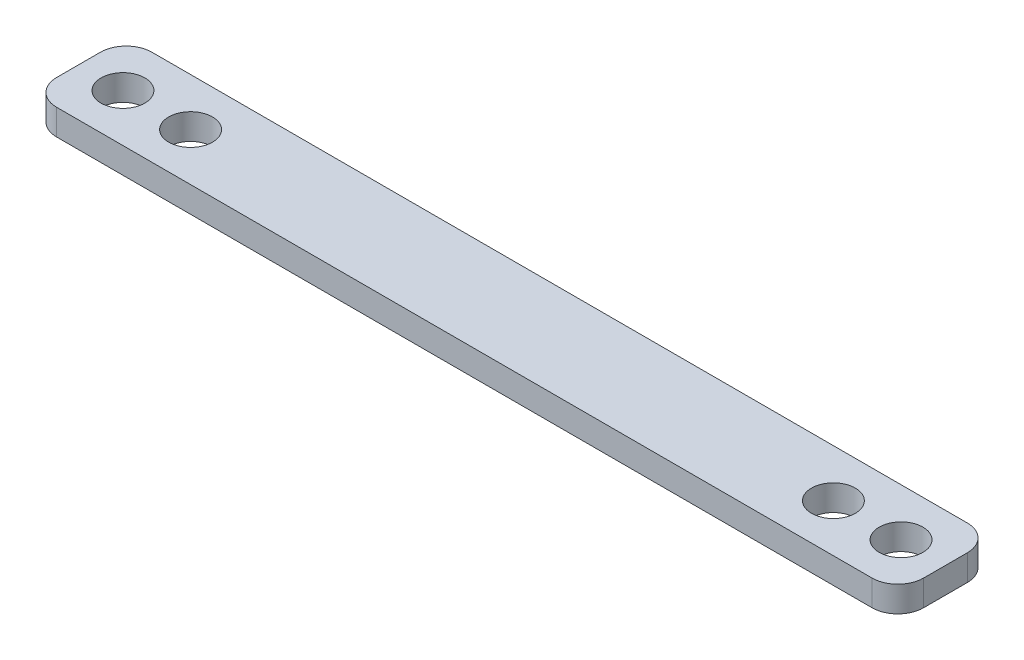
ISO-10303-21;
HEADER;
FILE_DESCRIPTION(('STEP AP214'),'2;1');
FILE_NAME('part.step','',(''),(''),'','','');
FILE_SCHEMA(('AUTOMOTIVE_DESIGN { 1 0 10303 214 1 1 1 1 }'));
ENDSEC;
DATA;
#1=APPLICATION_CONTEXT('core data for automotive mechanical design processes');
#2=APPLICATION_PROTOCOL_DEFINITION('international standard','automotive_design',2000,#1);
#3=PRODUCT_CONTEXT('',#1,'mechanical');
#4=PRODUCT('Part','Part','',(#3));
#5=PRODUCT_RELATED_PRODUCT_CATEGORY('part','',(#4));
#6=PRODUCT_DEFINITION_FORMATION('','',#4);
#7=PRODUCT_DEFINITION_CONTEXT('part definition',#1,'design');
#8=PRODUCT_DEFINITION('design','',#6,#7);
#9=PRODUCT_DEFINITION_SHAPE('','',#8);
#10=(LENGTH_UNIT() NAMED_UNIT(*) SI_UNIT(.MILLI.,.METRE.));
#11=(NAMED_UNIT(*) PLANE_ANGLE_UNIT() SI_UNIT($,.RADIAN.));
#12=(NAMED_UNIT(*) SI_UNIT($,.STERADIAN.) SOLID_ANGLE_UNIT());
#13=UNCERTAINTY_MEASURE_WITH_UNIT(LENGTH_MEASURE(1.E-05),#10,'distance_accuracy_value','');
#14=(GEOMETRIC_REPRESENTATION_CONTEXT(3) GLOBAL_UNCERTAINTY_ASSIGNED_CONTEXT((#13)) GLOBAL_UNIT_ASSIGNED_CONTEXT((#10,
#11,#12)) REPRESENTATION_CONTEXT('',''));
#15=CARTESIAN_POINT('',(0.,0.,0.));
#16=DIRECTION('',(0.,0.,1.));
#17=DIRECTION('',(1.,0.,0.));
#18=AXIS2_PLACEMENT_3D('',#15,#16,#17);
#19=CARTESIAN_POINT('',(0.,2.,-4.86679682508774));
#20=DIRECTION('',(0.,0.,1.));
#21=DIRECTION('',(1.,0.,0.));
#22=AXIS2_PLACEMENT_3D('',#19,#20,#21);
#23=PLANE('',#22);
#24=DIRECTION('',(-1.,0.,0.));
#25=VECTOR('',#24,1.);
#26=CARTESIAN_POINT('',(0.,2.,-4.86679682508774));
#27=LINE('',#26,#25);
#28=CARTESIAN_POINT('',(31.843938281881,2.,-4.86679682508774));
#29=VERTEX_POINT('',#28);
#30=CARTESIAN_POINT('',(-31.456061718119,2.,-4.86679682508773));
#31=VERTEX_POINT('',#30);
#32=EDGE_CURVE('E132',#29,#31,#27,.T.);
#33=ORIENTED_EDGE('',*,*,#32,.F.);
#34=DIRECTION('',(0.,-1.,0.));
#35=VECTOR('',#34,1.);
#36=CARTESIAN_POINT('',(31.843938281881,0.,-4.86679682508774));
#37=LINE('',#36,#35);
#38=CARTESIAN_POINT('',(31.843938281881,0.,-4.86679682508774));
#39=VERTEX_POINT('',#38);
#40=EDGE_CURVE('E116',#29,#39,#37,.T.);
#41=ORIENTED_EDGE('',*,*,#40,.T.);
#42=DIRECTION('',(-1.,0.,0.));
#43=VECTOR('',#42,1.);
#44=CARTESIAN_POINT('',(0.,0.,-4.86679682508774));
#45=LINE('',#44,#43);
#46=CARTESIAN_POINT('',(-31.456061718119,0.,-4.86679682508773));
#47=VERTEX_POINT('',#46);
#48=EDGE_CURVE('E129',#39,#47,#45,.T.);
#49=ORIENTED_EDGE('',*,*,#48,.T.);
#50=DIRECTION('',(0.,-1.,0.));
#51=VECTOR('',#50,1.);
#52=CARTESIAN_POINT('',(-31.456061718119,2.,-4.86679682508773));
#53=LINE('',#52,#51);
#54=EDGE_CURVE('E135',#47,#31,#53,.F.);
#55=ORIENTED_EDGE('',*,*,#54,.T.);
#56=EDGE_LOOP('',(#33,#41,#49,#55));
#57=FACE_BOUND('',#56,.T.);
#58=ADVANCED_FACE('F44',(#57),#23,.F.);
#59=CARTESIAN_POINT('',(-33.456061718119,2.,0.));
#60=DIRECTION('',(1.,0.,0.));
#61=DIRECTION('',(0.,0.,-1.));
#62=AXIS2_PLACEMENT_3D('',#59,#60,#61);
#63=PLANE('',#62);
#64=DIRECTION('',(0.,0.,1.));
#65=VECTOR('',#64,1.);
#66=CARTESIAN_POINT('',(-33.456061718119,2.,0.));
#67=LINE('',#66,#65);
#68=CARTESIAN_POINT('',(-33.456061718119,2.,-2.86679682508773));
#69=VERTEX_POINT('',#68);
#70=CARTESIAN_POINT('',(-33.456061718119,2.,0.533203174912269));
#71=VERTEX_POINT('',#70);
#72=EDGE_CURVE('E201',#69,#71,#67,.T.);
#73=ORIENTED_EDGE('',*,*,#72,.F.);
#74=DIRECTION('',(0.,-1.,0.));
#75=VECTOR('',#74,1.);
#76=CARTESIAN_POINT('',(-33.456061718119,2.,-2.86679682508773));
#77=LINE('',#76,#75);
#78=CARTESIAN_POINT('',(-33.456061718119,0.,-2.86679682508773));
#79=VERTEX_POINT('',#78);
#80=EDGE_CURVE('E11',#69,#79,#77,.T.);
#81=ORIENTED_EDGE('',*,*,#80,.T.);
#82=DIRECTION('',(0.,0.,1.));
#83=VECTOR('',#82,1.);
#84=CARTESIAN_POINT('',(-33.456061718119,0.,0.));
#85=LINE('',#84,#83);
#86=CARTESIAN_POINT('',(-33.456061718119,0.,0.533203174912269));
#87=VERTEX_POINT('',#86);
#88=EDGE_CURVE('E142',#79,#87,#85,.T.);
#89=ORIENTED_EDGE('',*,*,#88,.T.);
#90=DIRECTION('',(0.,-1.,0.));
#91=VECTOR('',#90,1.);
#92=CARTESIAN_POINT('',(-33.456061718119,2.,0.533203174912269));
#93=LINE('',#92,#91);
#94=EDGE_CURVE('E53',#87,#71,#93,.F.);
#95=ORIENTED_EDGE('',*,*,#94,.T.);
#96=EDGE_LOOP('',(#73,#81,#89,#95));
#97=FACE_BOUND('',#96,.T.);
#98=ADVANCED_FACE('F200',(#97),#63,.F.);
#99=CARTESIAN_POINT('',(0.,2.,2.53320317491226));
#100=DIRECTION('',(0.,0.,1.));
#101=DIRECTION('',(1.,0.,0.));
#102=AXIS2_PLACEMENT_3D('',#99,#100,#101);
#103=PLANE('',#102);
#104=DIRECTION('',(-1.,0.,0.));
#105=VECTOR('',#104,1.);
#106=CARTESIAN_POINT('',(0.,0.,2.53320317491226));
#107=LINE('',#106,#105);
#108=CARTESIAN_POINT('',(31.843938281881,0.,2.53320317491226));
#109=VERTEX_POINT('',#108);
#110=CARTESIAN_POINT('',(-31.456061718119,0.,2.53320317491227));
#111=VERTEX_POINT('',#110);
#112=EDGE_CURVE('E148',#109,#111,#107,.T.);
#113=ORIENTED_EDGE('',*,*,#112,.F.);
#114=DIRECTION('',(0.,-1.,0.));
#115=VECTOR('',#114,1.);
#116=CARTESIAN_POINT('',(31.843938281881,2.,2.53320317491226));
#117=LINE('',#116,#115);
#118=CARTESIAN_POINT('',(31.843938281881,2.,2.53320317491226));
#119=VERTEX_POINT('',#118);
#120=EDGE_CURVE('E67',#109,#119,#117,.F.);
#121=ORIENTED_EDGE('',*,*,#120,.T.);
#122=DIRECTION('',(-1.,0.,0.));
#123=VECTOR('',#122,1.);
#124=CARTESIAN_POINT('',(0.,2.,2.53320317491226));
#125=LINE('',#124,#123);
#126=CARTESIAN_POINT('',(-31.456061718119,2.,2.53320317491227));
#127=VERTEX_POINT('',#126);
#128=EDGE_CURVE('E209',#119,#127,#125,.T.);
#129=ORIENTED_EDGE('',*,*,#128,.T.);
#130=DIRECTION('',(0.,-1.,0.));
#131=VECTOR('',#130,1.);
#132=CARTESIAN_POINT('',(-31.456061718119,0.,2.53320317491227));
#133=LINE('',#132,#131);
#134=EDGE_CURVE('E191',#127,#111,#133,.T.);
#135=ORIENTED_EDGE('',*,*,#134,.T.);
#136=EDGE_LOOP('',(#113,#121,#129,#135));
#137=FACE_BOUND('',#136,.T.);
#138=ADVANCED_FACE('F212',(#137),#103,.T.);
#139=CARTESIAN_POINT('',(33.843938281881,2.,0.));
#140=DIRECTION('',(1.,0.,0.));
#141=DIRECTION('',(0.,0.,-1.));
#142=AXIS2_PLACEMENT_3D('',#139,#140,#141);
#143=PLANE('',#142);
#144=DIRECTION('',(0.,0.,1.));
#145=VECTOR('',#144,1.);
#146=CARTESIAN_POINT('',(33.843938281881,0.,0.));
#147=LINE('',#146,#145);
#148=CARTESIAN_POINT('',(33.843938281881,0.,-2.86679682508774));
#149=VERTEX_POINT('',#148);
#150=CARTESIAN_POINT('',(33.843938281881,0.,0.533203174912261));
#151=VERTEX_POINT('',#150);
#152=EDGE_CURVE('E158',#149,#151,#147,.T.);
#153=ORIENTED_EDGE('',*,*,#152,.F.);
#154=DIRECTION('',(0.,-1.,0.));
#155=VECTOR('',#154,1.);
#156=CARTESIAN_POINT('',(33.843938281881,2.,-2.86679682508774));
#157=LINE('',#156,#155);
#158=CARTESIAN_POINT('',(33.843938281881,2.,-2.86679682508774));
#159=VERTEX_POINT('',#158);
#160=EDGE_CURVE('E117',#149,#159,#157,.F.);
#161=ORIENTED_EDGE('',*,*,#160,.T.);
#162=DIRECTION('',(0.,0.,1.));
#163=VECTOR('',#162,1.);
#164=CARTESIAN_POINT('',(33.843938281881,2.,0.));
#165=LINE('',#164,#163);
#166=CARTESIAN_POINT('',(33.843938281881,2.,0.533203174912261));
#167=VERTEX_POINT('',#166);
#168=EDGE_CURVE('E220',#159,#167,#165,.T.);
#169=ORIENTED_EDGE('',*,*,#168,.T.);
#170=DIRECTION('',(0.,-1.,0.));
#171=VECTOR('',#170,1.);
#172=CARTESIAN_POINT('',(33.843938281881,2.,0.533203174912261));
#173=LINE('',#172,#171);
#174=EDGE_CURVE('E123',#167,#151,#173,.T.);
#175=ORIENTED_EDGE('',*,*,#174,.T.);
#176=EDGE_LOOP('',(#153,#161,#169,#175));
#177=FACE_BOUND('',#176,.T.);
#178=ADVANCED_FACE('F219',(#177),#143,.T.);
#179=CARTESIAN_POINT('',(25.143938281881,2.,-1.16679682508773));
#180=DIRECTION('',(0.,-1.,0.));
#181=DIRECTION('',(0.,0.,-1.));
#182=AXIS2_PLACEMENT_3D('',#179,#180,#181);
#183=CYLINDRICAL_SURFACE('',#182,1.7);
#184=CARTESIAN_POINT('',(25.143938281881,2.,-1.16679682508773));
#185=DIRECTION('',(0.,1.,0.));
#186=DIRECTION('',(0.,0.,1.));
#187=AXIS2_PLACEMENT_3D('',#184,#185,#186);
#188=CIRCLE('',#187,1.7);
#189=CARTESIAN_POINT('',(25.143938281881,2.,0.533203174912266));
#190=VERTEX_POINT('',#189);
#191=EDGE_CURVE('E283',#190,#190,#188,.F.);
#192=ORIENTED_EDGE('',*,*,#191,.F.);
#193=EDGE_LOOP('',(#192));
#194=FACE_BOUND('',#193,.T.);
#195=CARTESIAN_POINT('',(25.143938281881,0.,-1.16679682508773));
#196=DIRECTION('',(0.,1.,0.));
#197=DIRECTION('',(0.,0.,1.));
#198=AXIS2_PLACEMENT_3D('',#195,#196,#197);
#199=CIRCLE('',#198,1.7);
#200=CARTESIAN_POINT('',(25.143938281881,0.,0.533203174912266));
#201=VERTEX_POINT('',#200);
#202=EDGE_CURVE('E143',#201,#201,#199,.F.);
#203=ORIENTED_EDGE('',*,*,#202,.T.);
#204=EDGE_LOOP('',(#203));
#205=FACE_BOUND('',#204,.T.);
#206=ADVANCED_FACE('F241',(#194,#205),#183,.F.);
#207=CARTESIAN_POINT('',(-24.756061718119,2.,-1.16679682508773));
#208=DIRECTION('',(0.,-1.,0.));
#209=DIRECTION('',(0.,0.,-1.));
#210=AXIS2_PLACEMENT_3D('',#207,#208,#209);
#211=CYLINDRICAL_SURFACE('',#210,1.7);
#212=CARTESIAN_POINT('',(-24.756061718119,2.,-1.16679682508773));
#213=DIRECTION('',(0.,1.,0.));
#214=DIRECTION('',(0.,0.,1.));
#215=AXIS2_PLACEMENT_3D('',#212,#213,#214);
#216=CIRCLE('',#215,1.7);
#217=CARTESIAN_POINT('',(-24.756061718119,2.,0.533203174912266));
#218=VERTEX_POINT('',#217);
#219=EDGE_CURVE('E280',#218,#218,#216,.T.);
#220=ORIENTED_EDGE('',*,*,#219,.T.);
#221=EDGE_LOOP('',(#220));
#222=FACE_BOUND('',#221,.T.);
#223=CARTESIAN_POINT('',(-24.756061718119,0.,-1.16679682508773));
#224=DIRECTION('',(0.,1.,0.));
#225=DIRECTION('',(0.,0.,1.));
#226=AXIS2_PLACEMENT_3D('',#223,#224,#225);
#227=CIRCLE('',#226,1.7);
#228=CARTESIAN_POINT('',(-24.756061718119,0.,0.533203174912266));
#229=VERTEX_POINT('',#228);
#230=EDGE_CURVE('E151',#229,#229,#227,.T.);
#231=ORIENTED_EDGE('',*,*,#230,.F.);
#232=EDGE_LOOP('',(#231));
#233=FACE_BOUND('',#232,.T.);
#234=ADVANCED_FACE('F238',(#222,#233),#211,.F.);
#235=CARTESIAN_POINT('',(-30.006061718119,2.,-1.16679682508773));
#236=DIRECTION('',(0.,-1.,0.));
#237=DIRECTION('',(0.,0.,-1.));
#238=AXIS2_PLACEMENT_3D('',#235,#236,#237);
#239=CYLINDRICAL_SURFACE('',#238,1.7);
#240=CARTESIAN_POINT('',(-30.006061718119,2.,-1.16679682508773));
#241=DIRECTION('',(0.,1.,0.));
#242=DIRECTION('',(0.,0.,1.));
#243=AXIS2_PLACEMENT_3D('',#240,#241,#242);
#244=CIRCLE('',#243,1.7);
#245=CARTESIAN_POINT('',(-30.006061718119,2.,0.533203174912266));
#246=VERTEX_POINT('',#245);
#247=EDGE_CURVE('E165',#246,#246,#244,.T.);
#248=ORIENTED_EDGE('',*,*,#247,.T.);
#249=EDGE_LOOP('',(#248));
#250=FACE_BOUND('',#249,.T.);
#251=CARTESIAN_POINT('',(-30.006061718119,0.,-1.16679682508773));
#252=DIRECTION('',(0.,1.,0.));
#253=DIRECTION('',(0.,0.,1.));
#254=AXIS2_PLACEMENT_3D('',#251,#252,#253);
#255=CIRCLE('',#254,1.7);
#256=CARTESIAN_POINT('',(-30.006061718119,0.,0.533203174912266));
#257=VERTEX_POINT('',#256);
#258=EDGE_CURVE('E229',#257,#257,#255,.T.);
#259=ORIENTED_EDGE('',*,*,#258,.F.);
#260=EDGE_LOOP('',(#259));
#261=FACE_BOUND('',#260,.T.);
#262=ADVANCED_FACE('F240',(#250,#261),#239,.F.);
#263=CARTESIAN_POINT('',(30.393938281881,2.,-1.16679682508773));
#264=DIRECTION('',(0.,-1.,0.));
#265=DIRECTION('',(0.,0.,-1.));
#266=AXIS2_PLACEMENT_3D('',#263,#264,#265);
#267=CYLINDRICAL_SURFACE('',#266,1.7);
#268=CARTESIAN_POINT('',(30.393938281881,2.,-1.16679682508773));
#269=DIRECTION('',(0.,1.,0.));
#270=DIRECTION('',(0.,0.,1.));
#271=AXIS2_PLACEMENT_3D('',#268,#269,#270);
#272=CIRCLE('',#271,1.7);
#273=CARTESIAN_POINT('',(30.393938281881,2.,0.533203174912266));
#274=VERTEX_POINT('',#273);
#275=EDGE_CURVE('E167',#274,#274,#272,.F.);
#276=ORIENTED_EDGE('',*,*,#275,.F.);
#277=EDGE_LOOP('',(#276));
#278=FACE_BOUND('',#277,.T.);
#279=CARTESIAN_POINT('',(30.393938281881,0.,-1.16679682508773));
#280=DIRECTION('',(0.,1.,0.));
#281=DIRECTION('',(0.,0.,1.));
#282=AXIS2_PLACEMENT_3D('',#279,#280,#281);
#283=CIRCLE('',#282,1.7);
#284=CARTESIAN_POINT('',(30.393938281881,0.,0.533203174912266));
#285=VERTEX_POINT('',#284);
#286=EDGE_CURVE('E161',#285,#285,#283,.F.);
#287=ORIENTED_EDGE('',*,*,#286,.T.);
#288=EDGE_LOOP('',(#287));
#289=FACE_BOUND('',#288,.T.);
#290=ADVANCED_FACE('F248',(#278,#289),#267,.F.);
#291=CARTESIAN_POINT('',(0.,2.,0.));
#292=DIRECTION('',(0.,1.,0.));
#293=DIRECTION('',(0.,0.,1.));
#294=AXIS2_PLACEMENT_3D('',#291,#292,#293);
#295=PLANE('',#294);
#296=ORIENTED_EDGE('',*,*,#247,.F.);
#297=EDGE_LOOP('',(#296));
#298=FACE_BOUND('',#297,.T.);
#299=ORIENTED_EDGE('',*,*,#219,.F.);
#300=EDGE_LOOP('',(#299));
#301=FACE_BOUND('',#300,.T.);
#302=ORIENTED_EDGE('',*,*,#191,.T.);
#303=EDGE_LOOP('',(#302));
#304=FACE_BOUND('',#303,.T.);
#305=ORIENTED_EDGE('',*,*,#168,.F.);
#306=CARTESIAN_POINT('',(31.843938281881,2.,-2.86679682508774));
#307=DIRECTION('',(0.,1.,0.));
#308=DIRECTION('',(0.,0.,1.));
#309=AXIS2_PLACEMENT_3D('',#306,#307,#308);
#310=CIRCLE('',#309,2.);
#311=EDGE_CURVE('E188',#159,#29,#310,.T.);
#312=ORIENTED_EDGE('',*,*,#311,.T.);
#313=ORIENTED_EDGE('',*,*,#32,.T.);
#314=CARTESIAN_POINT('',(-31.456061718119,2.,-2.86679682508773));
#315=DIRECTION('',(0.,1.,0.));
#316=DIRECTION('',(0.,0.,1.));
#317=AXIS2_PLACEMENT_3D('',#314,#315,#316);
#318=CIRCLE('',#317,2.);
#319=EDGE_CURVE('E182',#31,#69,#318,.T.);
#320=ORIENTED_EDGE('',*,*,#319,.T.);
#321=ORIENTED_EDGE('',*,*,#72,.T.);
#322=CARTESIAN_POINT('',(-31.456061718119,2.,0.533203174912269));
#323=DIRECTION('',(0.,1.,0.));
#324=DIRECTION('',(0.,0.,1.));
#325=AXIS2_PLACEMENT_3D('',#322,#323,#324);
#326=CIRCLE('',#325,2.);
#327=EDGE_CURVE('E60',#71,#127,#326,.T.);
#328=ORIENTED_EDGE('',*,*,#327,.T.);
#329=ORIENTED_EDGE('',*,*,#128,.F.);
#330=CARTESIAN_POINT('',(31.843938281881,2.,0.533203174912261));
#331=DIRECTION('',(0.,1.,0.));
#332=DIRECTION('',(0.,0.,1.));
#333=AXIS2_PLACEMENT_3D('',#330,#331,#332);
#334=CIRCLE('',#333,2.);
#335=EDGE_CURVE('E185',#119,#167,#334,.T.);
#336=ORIENTED_EDGE('',*,*,#335,.T.);
#337=EDGE_LOOP('',(#305,#312,#313,#320,#321,#328,#329,#336));
#338=FACE_BOUND('',#337,.T.);
#339=ORIENTED_EDGE('',*,*,#275,.T.);
#340=EDGE_LOOP('',(#339));
#341=FACE_BOUND('',#340,.T.);
#342=ADVANCED_FACE('F205',(#298,#301,#304,#338,#341),#295,.T.);
#343=CARTESIAN_POINT('',(0.,0.,0.));
#344=DIRECTION('',(0.,1.,0.));
#345=DIRECTION('',(0.,0.,1.));
#346=AXIS2_PLACEMENT_3D('',#343,#344,#345);
#347=PLANE('',#346);
#348=ORIENTED_EDGE('',*,*,#258,.T.);
#349=EDGE_LOOP('',(#348));
#350=FACE_BOUND('',#349,.T.);
#351=ORIENTED_EDGE('',*,*,#230,.T.);
#352=EDGE_LOOP('',(#351));
#353=FACE_BOUND('',#352,.T.);
#354=ORIENTED_EDGE('',*,*,#202,.F.);
#355=EDGE_LOOP('',(#354));
#356=FACE_BOUND('',#355,.T.);
#357=ORIENTED_EDGE('',*,*,#48,.F.);
#358=CARTESIAN_POINT('',(31.843938281881,0.,-2.86679682508774));
#359=DIRECTION('',(0.,1.,0.));
#360=DIRECTION('',(0.,0.,1.));
#361=AXIS2_PLACEMENT_3D('',#358,#359,#360);
#362=CIRCLE('',#361,2.);
#363=EDGE_CURVE('E112',#39,#149,#362,.F.);
#364=ORIENTED_EDGE('',*,*,#363,.T.);
#365=ORIENTED_EDGE('',*,*,#152,.T.);
#366=CARTESIAN_POINT('',(31.843938281881,0.,0.533203174912261));
#367=DIRECTION('',(0.,1.,0.));
#368=DIRECTION('',(0.,0.,1.));
#369=AXIS2_PLACEMENT_3D('',#366,#367,#368);
#370=CIRCLE('',#369,2.);
#371=EDGE_CURVE('E124',#151,#109,#370,.F.);
#372=ORIENTED_EDGE('',*,*,#371,.T.);
#373=ORIENTED_EDGE('',*,*,#112,.T.);
#374=CARTESIAN_POINT('',(-31.456061718119,0.,0.533203174912269));
#375=DIRECTION('',(0.,1.,0.));
#376=DIRECTION('',(0.,0.,1.));
#377=AXIS2_PLACEMENT_3D('',#374,#375,#376);
#378=CIRCLE('',#377,2.);
#379=EDGE_CURVE('E134',#111,#87,#378,.F.);
#380=ORIENTED_EDGE('',*,*,#379,.T.);
#381=ORIENTED_EDGE('',*,*,#88,.F.);
#382=CARTESIAN_POINT('',(-31.456061718119,0.,-2.86679682508773));
#383=DIRECTION('',(0.,1.,0.));
#384=DIRECTION('',(0.,0.,1.));
#385=AXIS2_PLACEMENT_3D('',#382,#383,#384);
#386=CIRCLE('',#385,2.);
#387=EDGE_CURVE('E140',#79,#47,#386,.F.);
#388=ORIENTED_EDGE('',*,*,#387,.T.);
#389=EDGE_LOOP('',(#357,#364,#365,#372,#373,#380,#381,#388));
#390=FACE_BOUND('',#389,.T.);
#391=ORIENTED_EDGE('',*,*,#286,.F.);
#392=EDGE_LOOP('',(#391));
#393=FACE_BOUND('',#392,.T.);
#394=ADVANCED_FACE('F137',(#350,#353,#356,#390,#393),#347,.F.);
#395=CARTESIAN_POINT('',(31.843938281881,2.,-2.86679682508774));
#396=DIRECTION('',(0.,1.,0.));
#397=DIRECTION('',(0.,0.,1.));
#398=AXIS2_PLACEMENT_3D('',#395,#396,#397);
#399=CYLINDRICAL_SURFACE('',#398,2.);
#400=ORIENTED_EDGE('',*,*,#311,.F.);
#401=ORIENTED_EDGE('',*,*,#160,.F.);
#402=ORIENTED_EDGE('',*,*,#363,.F.);
#403=ORIENTED_EDGE('',*,*,#40,.F.);
#404=EDGE_LOOP('',(#400,#401,#402,#403));
#405=FACE_BOUND('',#404,.T.);
#406=ADVANCED_FACE('F115',(#405),#399,.T.);
#407=CARTESIAN_POINT('',(31.843938281881,2.,0.533203174912261));
#408=DIRECTION('',(0.,-1.,0.));
#409=DIRECTION('',(0.,0.,-1.));
#410=AXIS2_PLACEMENT_3D('',#407,#408,#409);
#411=CYLINDRICAL_SURFACE('',#410,2.);
#412=ORIENTED_EDGE('',*,*,#335,.F.);
#413=ORIENTED_EDGE('',*,*,#120,.F.);
#414=ORIENTED_EDGE('',*,*,#371,.F.);
#415=ORIENTED_EDGE('',*,*,#174,.F.);
#416=EDGE_LOOP('',(#412,#413,#414,#415));
#417=FACE_BOUND('',#416,.T.);
#418=ADVANCED_FACE('F216',(#417),#411,.T.);
#419=CARTESIAN_POINT('',(-31.456061718119,2.,-2.86679682508773));
#420=DIRECTION('',(0.,-1.,0.));
#421=DIRECTION('',(0.,0.,-1.));
#422=AXIS2_PLACEMENT_3D('',#419,#420,#421);
#423=CYLINDRICAL_SURFACE('',#422,2.);
#424=ORIENTED_EDGE('',*,*,#319,.F.);
#425=ORIENTED_EDGE('',*,*,#54,.F.);
#426=ORIENTED_EDGE('',*,*,#387,.F.);
#427=ORIENTED_EDGE('',*,*,#80,.F.);
#428=EDGE_LOOP('',(#424,#425,#426,#427));
#429=FACE_BOUND('',#428,.T.);
#430=ADVANCED_FACE('F295',(#429),#423,.T.);
#431=CARTESIAN_POINT('',(-31.456061718119,2.,0.533203174912269));
#432=DIRECTION('',(0.,1.,0.));
#433=DIRECTION('',(0.,0.,1.));
#434=AXIS2_PLACEMENT_3D('',#431,#432,#433);
#435=CYLINDRICAL_SURFACE('',#434,2.);
#436=ORIENTED_EDGE('',*,*,#327,.F.);
#437=ORIENTED_EDGE('',*,*,#94,.F.);
#438=ORIENTED_EDGE('',*,*,#379,.F.);
#439=ORIENTED_EDGE('',*,*,#134,.F.);
#440=EDGE_LOOP('',(#436,#437,#438,#439));
#441=FACE_BOUND('',#440,.T.);
#442=ADVANCED_FACE('F46',(#441),#435,.T.);
#443=CLOSED_SHELL('',(#58,#98,#138,#178,#206,#234,#262,#290,#342,#394,#406,#418,#430,#442));
#444=MANIFOLD_SOLID_BREP('B2',#443);
#445=ADVANCED_BREP_SHAPE_REPRESENTATION('',(#18,#444),#14);
#446=SHAPE_DEFINITION_REPRESENTATION(#9,#445);
ENDSEC;
END-ISO-10303-21;
